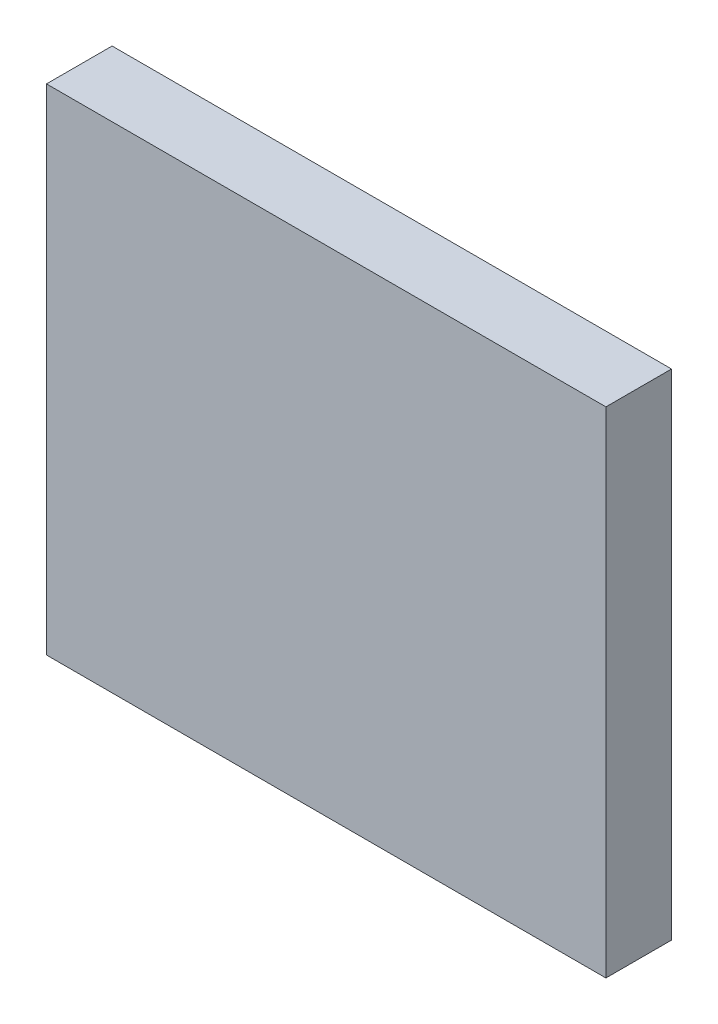
ISO-10303-21;
HEADER;
FILE_DESCRIPTION(('STEP AP214'),'2;1');
FILE_NAME('part.step','',(''),(''),'','','');
FILE_SCHEMA(('AUTOMOTIVE_DESIGN { 1 0 10303 214 1 1 1 1 }'));
ENDSEC;
DATA;
#1=APPLICATION_CONTEXT('core data for automotive mechanical design processes');
#2=APPLICATION_PROTOCOL_DEFINITION('international standard','automotive_design',2000,#1);
#3=PRODUCT_CONTEXT('',#1,'mechanical');
#4=PRODUCT('Part','Part','',(#3));
#5=PRODUCT_RELATED_PRODUCT_CATEGORY('part','',(#4));
#6=PRODUCT_DEFINITION_FORMATION('','',#4);
#7=PRODUCT_DEFINITION_CONTEXT('part definition',#1,'design');
#8=PRODUCT_DEFINITION('design','',#6,#7);
#9=PRODUCT_DEFINITION_SHAPE('','',#8);
#10=(LENGTH_UNIT() NAMED_UNIT(*) SI_UNIT(.MILLI.,.METRE.));
#11=(NAMED_UNIT(*) PLANE_ANGLE_UNIT() SI_UNIT($,.RADIAN.));
#12=(NAMED_UNIT(*) SI_UNIT($,.STERADIAN.) SOLID_ANGLE_UNIT());
#13=UNCERTAINTY_MEASURE_WITH_UNIT(LENGTH_MEASURE(1.E-05),#10,'distance_accuracy_value','');
#14=(GEOMETRIC_REPRESENTATION_CONTEXT(3) GLOBAL_UNCERTAINTY_ASSIGNED_CONTEXT((#13)) GLOBAL_UNIT_ASSIGNED_CONTEXT((#10,
#11,#12)) REPRESENTATION_CONTEXT('',''));
#15=CARTESIAN_POINT('',(0.,0.,0.));
#16=DIRECTION('',(0.,0.,1.));
#17=DIRECTION('',(1.,0.,0.));
#18=AXIS2_PLACEMENT_3D('',#15,#16,#17);
#19=CARTESIAN_POINT('',(-5.96866218,-5.27730466,1.39999974));
#20=DIRECTION('',(0.,0.,-1.));
#21=DIRECTION('',(0.,-1.,0.));
#22=AXIS2_PLACEMENT_3D('',#19,#20,#21);
#23=PLANE('',#22);
#24=DIRECTION('',(0.999999999998166,1.91500199750432E-06,0.));
#25=VECTOR('',#24,1.);
#26=CARTESIAN_POINT('',(-5.96866218,-5.27730466,1.39999974));
#27=LINE('',#26,#25);
#28=CARTESIAN_POINT('',(-5.96866218,-5.27730466,1.39999974));
#29=VERTEX_POINT('',#28);
#30=CARTESIAN_POINT('',(5.96866218,-5.2772818,1.39999974));
#31=VERTEX_POINT('',#30);
#32=EDGE_CURVE('E101',#29,#31,#27,.T.);
#33=ORIENTED_EDGE('',*,*,#32,.T.);
#34=DIRECTION('',(2.40653672848693E-07,0.999999999999971,0.));
#35=VECTOR('',#34,1.);
#36=CARTESIAN_POINT('',(5.96866218,-5.2772818,1.39999974));
#37=LINE('',#36,#35);
#38=CARTESIAN_POINT('',(5.96866472,5.27730466,1.39999974));
#39=VERTEX_POINT('',#38);
#40=EDGE_CURVE('E97',#31,#39,#37,.T.);
#41=ORIENTED_EDGE('',*,*,#40,.T.);
#42=DIRECTION('',(-1.,0.,0.));
#43=VECTOR('',#42,1.);
#44=CARTESIAN_POINT('',(5.96866472,5.27730466,1.39999974));
#45=LINE('',#44,#43);
#46=CARTESIAN_POINT('',(-5.96865964,5.27730466,1.39999974));
#47=VERTEX_POINT('',#46);
#48=EDGE_CURVE('E112',#39,#47,#45,.T.);
#49=ORIENTED_EDGE('',*,*,#48,.T.);
#50=DIRECTION('',(-2.40653151622093E-07,-0.999999999999971,0.));
#51=VECTOR('',#50,1.);
#52=CARTESIAN_POINT('',(-5.96865964,5.27730466,1.39999974));
#53=LINE('',#52,#51);
#54=EDGE_CURVE('E11',#47,#29,#53,.T.);
#55=ORIENTED_EDGE('',*,*,#54,.T.);
#56=EDGE_LOOP('',(#33,#41,#49,#55));
#57=FACE_BOUND('',#56,.T.);
#58=ADVANCED_FACE('F17',(#57),#23,.F.);
#59=CARTESIAN_POINT('',(-5.96866218,-5.27730466,0.));
#60=DIRECTION('',(0.,0.,-1.));
#61=DIRECTION('',(0.,-1.,0.));
#62=AXIS2_PLACEMENT_3D('',#59,#60,#61);
#63=PLANE('',#62);
#64=DIRECTION('',(-2.40653151622093E-07,-0.999999999999971,0.));
#65=VECTOR('',#64,1.);
#66=CARTESIAN_POINT('',(-5.96865964,5.27730466,0.));
#67=LINE('',#66,#65);
#68=CARTESIAN_POINT('',(-5.96865964,5.27730466,0.));
#69=VERTEX_POINT('',#68);
#70=CARTESIAN_POINT('',(-5.96866218,-5.27730466,0.));
#71=VERTEX_POINT('',#70);
#72=EDGE_CURVE('E26',#69,#71,#67,.T.);
#73=ORIENTED_EDGE('',*,*,#72,.F.);
#74=DIRECTION('',(-1.,0.,0.));
#75=VECTOR('',#74,1.);
#76=CARTESIAN_POINT('',(5.96866472,5.27730466,0.));
#77=LINE('',#76,#75);
#78=CARTESIAN_POINT('',(5.96866472,5.27730466,0.));
#79=VERTEX_POINT('',#78);
#80=EDGE_CURVE('E74',#79,#69,#77,.T.);
#81=ORIENTED_EDGE('',*,*,#80,.F.);
#82=DIRECTION('',(2.40653672848693E-07,0.999999999999971,0.));
#83=VECTOR('',#82,1.);
#84=CARTESIAN_POINT('',(5.96866218,-5.2772818,0.));
#85=LINE('',#84,#83);
#86=CARTESIAN_POINT('',(5.96866218,-5.2772818,0.));
#87=VERTEX_POINT('',#86);
#88=EDGE_CURVE('E83',#87,#79,#85,.T.);
#89=ORIENTED_EDGE('',*,*,#88,.F.);
#90=DIRECTION('',(0.999999999998166,1.91500199750432E-06,0.));
#91=VECTOR('',#90,1.);
#92=CARTESIAN_POINT('',(-5.96866218,-5.27730466,0.));
#93=LINE('',#92,#91);
#94=EDGE_CURVE('E86',#71,#87,#93,.T.);
#95=ORIENTED_EDGE('',*,*,#94,.F.);
#96=EDGE_LOOP('',(#73,#81,#89,#95));
#97=FACE_BOUND('',#96,.T.);
#98=ADVANCED_FACE('F19',(#97),#63,.T.);
#99=CARTESIAN_POINT('',(-5.96865964,5.27730466,0.));
#100=DIRECTION('',(0.999999999999971,-2.40653151622093E-07,0.));
#101=DIRECTION('',(0.,0.,-1.));
#102=AXIS2_PLACEMENT_3D('',#99,#100,#101);
#103=PLANE('',#102);
#104=ORIENTED_EDGE('',*,*,#72,.T.);
#105=DIRECTION('',(0.,0.,1.));
#106=VECTOR('',#105,1.);
#107=CARTESIAN_POINT('',(-5.96866218,-5.27730466,0.));
#108=LINE('',#107,#106);
#109=EDGE_CURVE('E91',#71,#29,#108,.T.);
#110=ORIENTED_EDGE('',*,*,#109,.T.);
#111=ORIENTED_EDGE('',*,*,#54,.F.);
#112=DIRECTION('',(0.,0.,1.));
#113=VECTOR('',#112,1.);
#114=CARTESIAN_POINT('',(-5.96865964,5.27730466,0.));
#115=LINE('',#114,#113);
#116=EDGE_CURVE('E116',#69,#47,#115,.T.);
#117=ORIENTED_EDGE('',*,*,#116,.F.);
#118=EDGE_LOOP('',(#104,#110,#111,#117));
#119=FACE_BOUND('',#118,.T.);
#120=ADVANCED_FACE('F130',(#119),#103,.F.);
#121=CARTESIAN_POINT('',(5.96866472,5.27730466,0.));
#122=DIRECTION('',(0.,-1.,0.));
#123=DIRECTION('',(0.,0.,-1.));
#124=AXIS2_PLACEMENT_3D('',#121,#122,#123);
#125=PLANE('',#124);
#126=ORIENTED_EDGE('',*,*,#80,.T.);
#127=ORIENTED_EDGE('',*,*,#116,.T.);
#128=ORIENTED_EDGE('',*,*,#48,.F.);
#129=DIRECTION('',(0.,0.,1.));
#130=VECTOR('',#129,1.);
#131=CARTESIAN_POINT('',(5.96866472,5.27730466,0.));
#132=LINE('',#131,#130);
#133=EDGE_CURVE('E90',#79,#39,#132,.T.);
#134=ORIENTED_EDGE('',*,*,#133,.F.);
#135=EDGE_LOOP('',(#126,#127,#128,#134));
#136=FACE_BOUND('',#135,.T.);
#137=ADVANCED_FACE('F129',(#136),#125,.F.);
#138=CARTESIAN_POINT('',(5.96866218,-5.2772818,0.));
#139=DIRECTION('',(-0.999999999999971,2.40653672848693E-07,0.));
#140=DIRECTION('',(0.,0.,1.));
#141=AXIS2_PLACEMENT_3D('',#138,#139,#140);
#142=PLANE('',#141);
#143=ORIENTED_EDGE('',*,*,#88,.T.);
#144=ORIENTED_EDGE('',*,*,#133,.T.);
#145=ORIENTED_EDGE('',*,*,#40,.F.);
#146=DIRECTION('',(0.,0.,1.));
#147=VECTOR('',#146,1.);
#148=CARTESIAN_POINT('',(5.96866218,-5.2772818,0.));
#149=LINE('',#148,#147);
#150=EDGE_CURVE('E94',#87,#31,#149,.T.);
#151=ORIENTED_EDGE('',*,*,#150,.F.);
#152=EDGE_LOOP('',(#143,#144,#145,#151));
#153=FACE_BOUND('',#152,.T.);
#154=ADVANCED_FACE('F95',(#153),#142,.F.);
#155=CARTESIAN_POINT('',(-5.96866218,-5.27730466,0.));
#156=DIRECTION('',(-1.91500199750432E-06,0.999999999998166,0.));
#157=DIRECTION('',(0.,0.,1.));
#158=AXIS2_PLACEMENT_3D('',#155,#156,#157);
#159=PLANE('',#158);
#160=ORIENTED_EDGE('',*,*,#94,.T.);
#161=ORIENTED_EDGE('',*,*,#150,.T.);
#162=ORIENTED_EDGE('',*,*,#32,.F.);
#163=ORIENTED_EDGE('',*,*,#109,.F.);
#164=EDGE_LOOP('',(#160,#161,#162,#163));
#165=FACE_BOUND('',#164,.T.);
#166=ADVANCED_FACE('F103',(#165),#159,.F.);
#167=CLOSED_SHELL('',(#58,#98,#120,#137,#154,#166));
#168=MANIFOLD_SOLID_BREP('B1',#167);
#169=ADVANCED_BREP_SHAPE_REPRESENTATION('',(#18,#168),#14);
#170=SHAPE_DEFINITION_REPRESENTATION(#9,#169);
ENDSEC;
END-ISO-10303-21;
